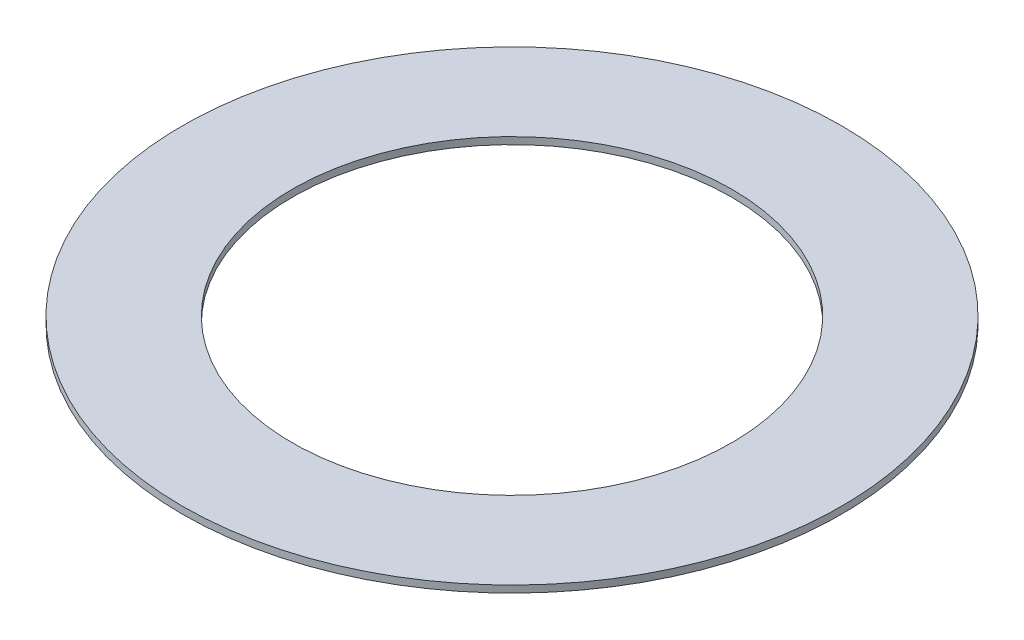
ISO-10303-21;
HEADER;
FILE_DESCRIPTION(('STEP AP214'),'2;1');
FILE_NAME('part.step','',(''),(''),'','','');
FILE_SCHEMA(('AUTOMOTIVE_DESIGN { 1 0 10303 214 1 1 1 1 }'));
ENDSEC;
DATA;
#1=APPLICATION_CONTEXT('core data for automotive mechanical design processes');
#2=APPLICATION_PROTOCOL_DEFINITION('international standard','automotive_design',2000,#1);
#3=PRODUCT_CONTEXT('',#1,'mechanical');
#4=PRODUCT('Part','Part','',(#3));
#5=PRODUCT_RELATED_PRODUCT_CATEGORY('part','',(#4));
#6=PRODUCT_DEFINITION_FORMATION('','',#4);
#7=PRODUCT_DEFINITION_CONTEXT('part definition',#1,'design');
#8=PRODUCT_DEFINITION('design','',#6,#7);
#9=PRODUCT_DEFINITION_SHAPE('','',#8);
#10=(LENGTH_UNIT() NAMED_UNIT(*) SI_UNIT(.MILLI.,.METRE.));
#11=(NAMED_UNIT(*) PLANE_ANGLE_UNIT() SI_UNIT($,.RADIAN.));
#12=(NAMED_UNIT(*) SI_UNIT($,.STERADIAN.) SOLID_ANGLE_UNIT());
#13=UNCERTAINTY_MEASURE_WITH_UNIT(LENGTH_MEASURE(1.E-05),#10,'distance_accuracy_value','');
#14=(GEOMETRIC_REPRESENTATION_CONTEXT(3) GLOBAL_UNCERTAINTY_ASSIGNED_CONTEXT((#13)) GLOBAL_UNIT_ASSIGNED_CONTEXT((#10,
#11,#12)) REPRESENTATION_CONTEXT('',''));
#15=CARTESIAN_POINT('',(0.,0.,0.));
#16=DIRECTION('',(0.,0.,1.));
#17=DIRECTION('',(1.,0.,0.));
#18=AXIS2_PLACEMENT_3D('',#15,#16,#17);
#19=CARTESIAN_POINT('',(0.,0.,0.));
#20=DIRECTION('',(0.,1.,0.));
#21=DIRECTION('',(0.,0.,1.));
#22=AXIS2_PLACEMENT_3D('',#19,#20,#21);
#23=PLANE('',#22);
#24=CARTESIAN_POINT('',(0.,0.,0.));
#25=DIRECTION('',(0.,-1.,0.));
#26=DIRECTION('',(0.,0.,-1.));
#27=AXIS2_PLACEMENT_3D('',#24,#25,#26);
#28=CIRCLE('',#27,4.);
#29=CARTESIAN_POINT('',(0.,0.,-4.));
#30=VERTEX_POINT('',#29);
#31=EDGE_CURVE('E26',#30,#30,#28,.F.);
#32=ORIENTED_EDGE('',*,*,#31,.T.);
#33=EDGE_LOOP('',(#32));
#34=FACE_BOUND('',#33,.T.);
#35=CARTESIAN_POINT('',(0.,0.,0.));
#36=DIRECTION('',(0.,-1.,0.));
#37=DIRECTION('',(0.,0.,-1.));
#38=AXIS2_PLACEMENT_3D('',#35,#36,#37);
#39=CIRCLE('',#38,6.);
#40=CARTESIAN_POINT('',(0.,0.,-6.));
#41=VERTEX_POINT('',#40);
#42=EDGE_CURVE('E17',#41,#41,#39,.F.);
#43=ORIENTED_EDGE('',*,*,#42,.F.);
#44=EDGE_LOOP('',(#43));
#45=FACE_BOUND('',#44,.T.);
#46=ADVANCED_FACE('F14',(#34,#45),#23,.F.);
#47=CARTESIAN_POINT('',(0.,0.127,0.));
#48=DIRECTION('',(0.,-1.,0.));
#49=DIRECTION('',(0.,0.,-1.));
#50=AXIS2_PLACEMENT_3D('',#47,#48,#49);
#51=CYLINDRICAL_SURFACE('',#50,6.);
#52=ORIENTED_EDGE('',*,*,#42,.T.);
#53=EDGE_LOOP('',(#52));
#54=FACE_BOUND('',#53,.T.);
#55=CARTESIAN_POINT('',(0.,0.127,0.));
#56=DIRECTION('',(0.,-1.,0.));
#57=DIRECTION('',(0.,0.,-1.));
#58=AXIS2_PLACEMENT_3D('',#55,#56,#57);
#59=CIRCLE('',#58,6.);
#60=CARTESIAN_POINT('',(0.,0.127,-6.));
#61=VERTEX_POINT('',#60);
#62=EDGE_CURVE('E21',#61,#61,#59,.F.);
#63=ORIENTED_EDGE('',*,*,#62,.F.);
#64=EDGE_LOOP('',(#63));
#65=FACE_BOUND('',#64,.T.);
#66=ADVANCED_FACE('F34',(#54,#65),#51,.T.);
#67=CARTESIAN_POINT('',(0.,0.127,0.));
#68=DIRECTION('',(0.,-1.,0.));
#69=DIRECTION('',(0.,0.,-1.));
#70=AXIS2_PLACEMENT_3D('',#67,#68,#69);
#71=CYLINDRICAL_SURFACE('',#70,4.);
#72=CARTESIAN_POINT('',(0.,0.127,0.));
#73=DIRECTION('',(0.,-1.,0.));
#74=DIRECTION('',(0.,0.,-1.));
#75=AXIS2_PLACEMENT_3D('',#72,#73,#74);
#76=CIRCLE('',#75,4.);
#77=CARTESIAN_POINT('',(0.,0.127,-4.));
#78=VERTEX_POINT('',#77);
#79=EDGE_CURVE('E10',#78,#78,#76,.T.);
#80=ORIENTED_EDGE('',*,*,#79,.F.);
#81=EDGE_LOOP('',(#80));
#82=FACE_BOUND('',#81,.T.);
#83=ORIENTED_EDGE('',*,*,#31,.F.);
#84=EDGE_LOOP('',(#83));
#85=FACE_BOUND('',#84,.T.);
#86=ADVANCED_FACE('F42',(#82,#85),#71,.F.);
#87=CARTESIAN_POINT('',(0.,0.127,0.));
#88=DIRECTION('',(0.,1.,0.));
#89=DIRECTION('',(0.,0.,1.));
#90=AXIS2_PLACEMENT_3D('',#87,#88,#89);
#91=PLANE('',#90);
#92=ORIENTED_EDGE('',*,*,#79,.T.);
#93=EDGE_LOOP('',(#92));
#94=FACE_BOUND('',#93,.T.);
#95=ORIENTED_EDGE('',*,*,#62,.T.);
#96=EDGE_LOOP('',(#95));
#97=FACE_BOUND('',#96,.T.);
#98=ADVANCED_FACE('F43',(#94,#97),#91,.T.);
#99=CLOSED_SHELL('',(#46,#66,#86,#98));
#100=MANIFOLD_SOLID_BREP('B1',#99);
#101=ADVANCED_BREP_SHAPE_REPRESENTATION('',(#18,#100),#14);
#102=SHAPE_DEFINITION_REPRESENTATION(#9,#101);
ENDSEC;
END-ISO-10303-21;
